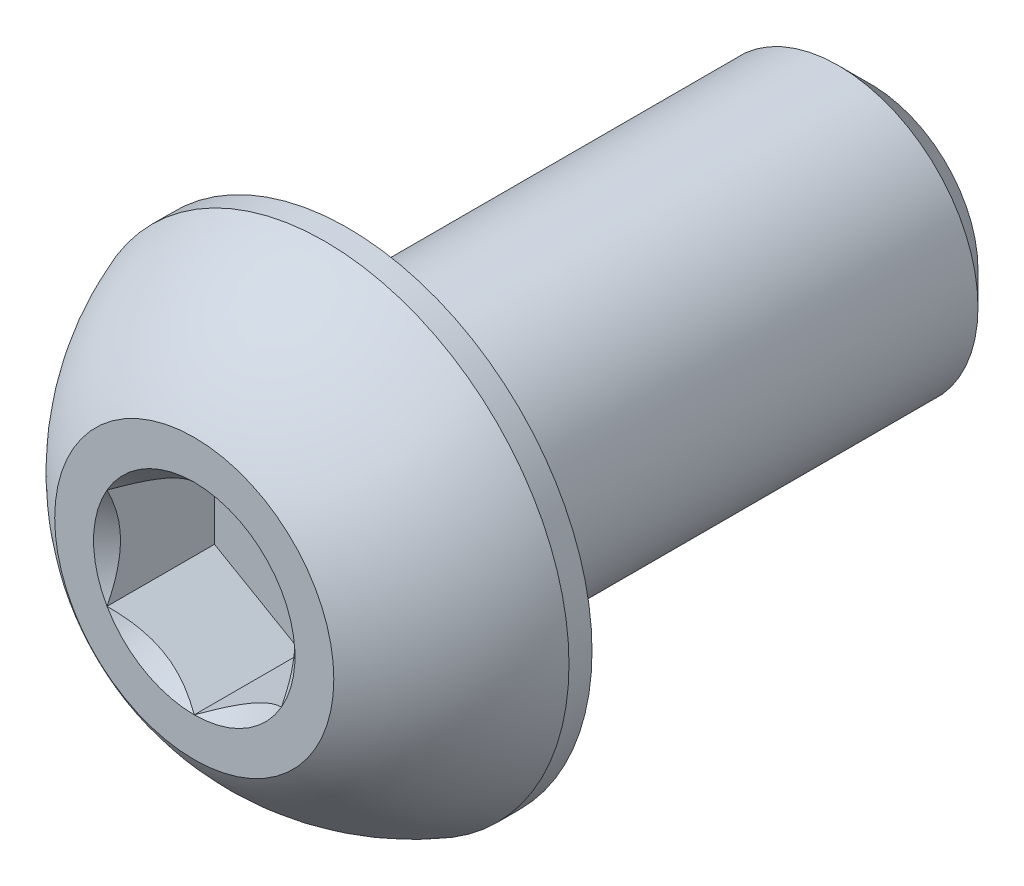
ISO-10303-21;
HEADER;
FILE_DESCRIPTION(('STEP AP214'),'2;1');
FILE_NAME('part.step','',(''),(''),'','','');
FILE_SCHEMA(('AUTOMOTIVE_DESIGN { 1 0 10303 214 1 1 1 1 }'));
ENDSEC;
DATA;
#1=APPLICATION_CONTEXT('core data for automotive mechanical design processes');
#2=APPLICATION_PROTOCOL_DEFINITION('international standard','automotive_design',2000,#1);
#3=PRODUCT_CONTEXT('',#1,'mechanical');
#4=PRODUCT('Part','Part','',(#3));
#5=PRODUCT_RELATED_PRODUCT_CATEGORY('part','',(#4));
#6=PRODUCT_DEFINITION_FORMATION('','',#4);
#7=PRODUCT_DEFINITION_CONTEXT('part definition',#1,'design');
#8=PRODUCT_DEFINITION('design','',#6,#7);
#9=PRODUCT_DEFINITION_SHAPE('','',#8);
#10=(LENGTH_UNIT() NAMED_UNIT(*) SI_UNIT(.MILLI.,.METRE.));
#11=(NAMED_UNIT(*) PLANE_ANGLE_UNIT() SI_UNIT($,.RADIAN.));
#12=(NAMED_UNIT(*) SI_UNIT($,.STERADIAN.) SOLID_ANGLE_UNIT());
#13=UNCERTAINTY_MEASURE_WITH_UNIT(LENGTH_MEASURE(1.E-05),#10,'distance_accuracy_value','');
#14=(GEOMETRIC_REPRESENTATION_CONTEXT(3) GLOBAL_UNCERTAINTY_ASSIGNED_CONTEXT((#13)) GLOBAL_UNIT_ASSIGNED_CONTEXT((#10,
#11,#12)) REPRESENTATION_CONTEXT('',''));
#15=CARTESIAN_POINT('',(0.,0.,0.));
#16=DIRECTION('',(0.,0.,1.));
#17=DIRECTION('',(1.,0.,0.));
#18=AXIS2_PLACEMENT_3D('',#15,#16,#17);
#19=CARTESIAN_POINT('',(0.,0.,-19.4));
#20=DIRECTION('',(0.,0.,1.));
#21=DIRECTION('',(1.,0.,0.));
#22=AXIS2_PLACEMENT_3D('',#19,#20,#21);
#23=PLANE('',#22);
#24=CARTESIAN_POINT('',(0.,0.,-19.4));
#25=DIRECTION('',(0.,0.,1.));
#26=DIRECTION('',(1.,0.,0.));
#27=AXIS2_PLACEMENT_3D('',#24,#25,#26);
#28=CIRCLE('',#27,3.06250000000002);
#29=CARTESIAN_POINT('',(3.06250000000002,0.,-19.4));
#30=VERTEX_POINT('',#29);
#31=EDGE_CURVE('E54',#30,#30,#28,.T.);
#32=ORIENTED_EDGE('',*,*,#31,.F.);
#33=EDGE_LOOP('',(#32));
#34=FACE_BOUND('',#33,.T.);
#35=ADVANCED_FACE('F41',(#34),#23,.F.);
#36=CARTESIAN_POINT('',(0.,0.,-19.4));
#37=DIRECTION('',(0.,0.,1.));
#38=DIRECTION('',(1.,0.,0.));
#39=AXIS2_PLACEMENT_3D('',#36,#37,#38);
#40=CONICAL_SURFACE('',#39,3.06250000000002,0.78539816339744);
#41=CARTESIAN_POINT('',(0.,0.,-18.4625));
#42=DIRECTION('',(0.,0.,1.));
#43=DIRECTION('',(1.,0.,0.));
#44=AXIS2_PLACEMENT_3D('',#41,#42,#43);
#45=CIRCLE('',#44,4.00000000000001);
#46=CARTESIAN_POINT('',(4.00000000000001,0.,-18.4625));
#47=VERTEX_POINT('',#46);
#48=EDGE_CURVE('E180',#47,#47,#45,.T.);
#49=ORIENTED_EDGE('',*,*,#48,.F.);
#50=EDGE_LOOP('',(#49));
#51=FACE_BOUND('',#50,.T.);
#52=ORIENTED_EDGE('',*,*,#31,.T.);
#53=EDGE_LOOP('',(#52));
#54=FACE_BOUND('',#53,.T.);
#55=ADVANCED_FACE('F185',(#51,#54),#40,.T.);
#56=CARTESIAN_POINT('',(0.,0.,0.));
#57=DIRECTION('',(0.,0.,1.));
#58=DIRECTION('',(1.,0.,0.));
#59=AXIS2_PLACEMENT_3D('',#56,#57,#58);
#60=CYLINDRICAL_SURFACE('',#59,4.00000000000001);
#61=CARTESIAN_POINT('',(0.,0.,-4.4));
#62=DIRECTION('',(0.,0.,1.));
#63=DIRECTION('',(1.,0.,0.));
#64=AXIS2_PLACEMENT_3D('',#61,#62,#63);
#65=CIRCLE('',#64,4.00000000000001);
#66=CARTESIAN_POINT('',(4.00000000000001,0.,-4.4));
#67=VERTEX_POINT('',#66);
#68=EDGE_CURVE('E177',#67,#67,#65,.T.);
#69=ORIENTED_EDGE('',*,*,#68,.F.);
#70=EDGE_LOOP('',(#69));
#71=FACE_BOUND('',#70,.T.);
#72=ORIENTED_EDGE('',*,*,#48,.T.);
#73=EDGE_LOOP('',(#72));
#74=FACE_BOUND('',#73,.T.);
#75=ADVANCED_FACE('F191',(#71,#74),#60,.T.);
#76=CARTESIAN_POINT('',(0.,-7.,-4.4));
#77=DIRECTION('',(0.,0.,1.));
#78=DIRECTION('',(1.,0.,0.));
#79=AXIS2_PLACEMENT_3D('',#76,#77,#78);
#80=PLANE('',#79);
#81=CARTESIAN_POINT('',(0.,0.,-4.4));
#82=DIRECTION('',(0.,0.,1.));
#83=DIRECTION('',(1.,0.,0.));
#84=AXIS2_PLACEMENT_3D('',#81,#82,#83);
#85=CIRCLE('',#84,7.);
#86=CARTESIAN_POINT('',(7.,0.,-4.4));
#87=VERTEX_POINT('',#86);
#88=EDGE_CURVE('E171',#87,#87,#85,.T.);
#89=ORIENTED_EDGE('',*,*,#88,.F.);
#90=EDGE_LOOP('',(#89));
#91=FACE_BOUND('',#90,.T.);
#92=ORIENTED_EDGE('',*,*,#68,.T.);
#93=EDGE_LOOP('',(#92));
#94=FACE_BOUND('',#93,.T.);
#95=ADVANCED_FACE('F196',(#91,#94),#80,.F.);
#96=CARTESIAN_POINT('',(0.,0.,-6.28176470588235));
#97=DIRECTION('',(0.,0.,1.));
#98=DIRECTION('',(0.,-1.,0.));
#99=AXIS2_PLACEMENT_3D('',#96,#97,#98);
#100=SPHERICAL_SURFACE('',#99,7.44718522799516);
#101=CARTESIAN_POINT('',(0.,0.,0.));
#102=DIRECTION('',(0.,0.,1.));
#103=DIRECTION('',(1.,0.,0.));
#104=AXIS2_PLACEMENT_3D('',#101,#102,#103);
#105=CIRCLE('',#104,4.00000000000001);
#106=CARTESIAN_POINT('',(0.,-4.00000000000001,0.));
#107=VERTEX_POINT('',#106);
#108=EDGE_CURVE('E174',#107,#107,#105,.T.);
#109=CARTESIAN_POINT('',(0.,0.,-3.74));
#110=DIRECTION('',(0.,0.,1.));
#111=DIRECTION('',(1.,0.,0.));
#112=AXIS2_PLACEMENT_3D('',#109,#110,#111);
#113=CIRCLE('',#112,7.);
#114=CARTESIAN_POINT('',(0.,-7.,-3.74));
#115=VERTEX_POINT('',#114);
#116=EDGE_CURVE('E168',#115,#115,#113,.T.);
#117=CARTESIAN_POINT('',(0.,-4.00000000000001,0.));
#118=CARTESIAN_POINT('',(0.,-4.0428912139663,-0.0273114768916097));
#119=CARTESIAN_POINT('',(0.,-4.08550262268995,-0.0550623662746863));
#120=CARTESIAN_POINT('',(0.,-4.17014814240247,-0.111431039851167));
#121=CARTESIAN_POINT('',(0.,-4.21218225339134,-0.140048824044572));
#122=CARTESIAN_POINT('',(0.,-4.29565549038475,-0.198139357069099));
#123=CARTESIAN_POINT('',(0.,-4.33709461638929,-0.227612105900221));
#124=CARTESIAN_POINT('',(0.,-4.41936051070081,-0.287400181855632));
#125=CARTESIAN_POINT('',(0.,-4.46018727900778,-0.31771550897992));
#126=CARTESIAN_POINT('',(0.,-4.54121132474489,-0.379176027774173));
#127=CARTESIAN_POINT('',(0.,-4.58140860217503,-0.410321219444137));
#128=CARTESIAN_POINT('',(0.,-4.66115680175155,-0.473428398402514));
#129=CARTESIAN_POINT('',(0.,-4.70070772389794,-0.505390385690926));
#130=CARTESIAN_POINT('',(0.,-4.77914661843988,-0.570117746134584));
#131=CARTESIAN_POINT('',(0.,-4.81803459083544,-0.602883119289829));
#132=CARTESIAN_POINT('',(0.,-4.89513126989405,-0.669203504140152));
#133=CARTESIAN_POINT('',(0.,-4.9333399765571,-0.70275851583523));
#134=CARTESIAN_POINT('',(0.,-5.00906209307587,-0.770644099267723));
#135=CARTESIAN_POINT('',(0.,-5.04657550293158,-0.804974671005139));
#136=CARTESIAN_POINT('',(0.,-5.12089128650743,-0.874396970590494));
#137=CARTESIAN_POINT('',(0.,-5.15769366022755,-0.909488698438432));
#138=CARTESIAN_POINT('',(0.,-5.23057193052378,-0.980418586967821));
#139=CARTESIAN_POINT('',(0.,-5.26664782709989,-1.01625674764927));
#140=CARTESIAN_POINT('',(0.,-5.33805800690611,-1.0886644653886));
#141=CARTESIAN_POINT('',(0.,-5.37339229013624,-1.12523402244648));
#142=CARTESIAN_POINT('',(0.,-5.44330441820348,-1.19908918961359));
#143=CARTESIAN_POINT('',(0.,-5.4778822630406,-1.23637479972282));
#144=CARTESIAN_POINT('',(0.,-5.5462670066504,-1.31164642923617));
#145=CARTESIAN_POINT('',(0.,-5.58007390542308,-1.34963244864029));
#146=CARTESIAN_POINT('',(0.,-5.64690257269493,-1.42628895911946));
#147=CARTESIAN_POINT('',(0.,-5.67992434119409,-1.4649594501945));
#148=CARTESIAN_POINT('',(0.,-5.74516889312342,-1.54296867921078));
#149=CARTESIAN_POINT('',(0.,-5.77739167655358,-1.58230741715202));
#150=CARTESIAN_POINT('',(0.,-5.84102473877602,-1.66163663472265));
#151=CARTESIAN_POINT('',(0.,-5.87243501756828,-1.70162711435204));
#152=CARTESIAN_POINT('',(0.,-5.93442989184496,-1.78224303667259));
#153=CARTESIAN_POINT('',(0.,-5.96501448732938,-1.82286847936374));
#154=CARTESIAN_POINT('',(0.,-6.02534516274862,-1.9047372827728));
#155=CARTESIAN_POINT('',(0.,-6.05509124268345,-1.9459806434907));
#156=CARTESIAN_POINT('',(0.,-6.11373240657404,-2.02906797866118));
#157=CARTESIAN_POINT('',(0.,-6.1426274905298,-2.07091195311374));
#158=CARTESIAN_POINT('',(0.,-6.19955453908126,-2.15518295946462));
#159=CARTESIAN_POINT('',(0.,-6.22758650367697,-2.19760999136295));
#160=CARTESIAN_POINT('',(0.,-6.28277555226269,-2.28302931168557));
#161=CARTESIAN_POINT('',(0.,-6.3099326362527,-2.32602160010988));
#162=CARTESIAN_POINT('',(0.,-6.36336052945034,-2.41255339540285));
#163=CARTESIAN_POINT('',(0.,-6.38963133865797,-2.45609290227151));
#164=CARTESIAN_POINT('',(0.,-6.44127565996739,-2.54370086677645));
#165=CARTESIAN_POINT('',(0.,-6.46664917206918,-2.58776932441273));
#166=CARTESIAN_POINT('',(0.,-6.5164882533076,-2.67641670085086));
#167=CARTESIAN_POINT('',(0.,-6.54095382244421,-2.7209956196527));
#168=CARTESIAN_POINT('',(0.,-6.5889667528749,-2.81064521463237));
#169=CARTESIAN_POINT('',(0.,-6.61251411416897,-2.8557158908102));
#170=CARTESIAN_POINT('',(0.,-6.65868074913471,-2.94633009048611));
#171=CARTESIAN_POINT('',(0.,-6.68130002280637,-2.99187361398419));
#172=CARTESIAN_POINT('',(0.,-6.72560099270397,-3.08341439963689));
#173=CARTESIAN_POINT('',(0.,-6.74728268892991,-3.12941166179151));
#174=CARTESIAN_POINT('',(0.,-6.78969940538681,-3.22184062653245));
#175=CARTESIAN_POINT('',(0.,-6.81043442561777,-3.26827232911879));
#176=CARTESIAN_POINT('',(0.,-6.85094909656955,-3.36155069119163));
#177=CARTESIAN_POINT('',(0.,-6.87072874729038,-3.40839735067814));
#178=CARTESIAN_POINT('',(0.,-6.90932435728194,-3.50248598022821));
#179=CARTESIAN_POINT('',(0.,-6.92814031655268,-3.54972795029177));
#180=CARTESIAN_POINT('',(0.,-6.96480073525398,-3.64458734660453));
#181=CARTESIAN_POINT('',(0.,-6.98264519468455,-3.69220477285372));
#182=CARTESIAN_POINT('',(0.,-7.,-3.74));
#183=B_SPLINE_CURVE_WITH_KNOTS('',3,(#117,#118,#119,#120,#121,#122,#123,#124,#125,#126,#127,
#128,#129,#130,#131,#132,#133,#134,#135,#136,#137,#138,#139,#140,#141,#142,#143,#144,#145,#146,
#147,#148,#149,#150,#151,#152,#153,#154,#155,#156,#157,#158,#159,#160,#161,#162,#163,#164,#165,
#166,#167,#168,#169,#170,#171,#172,#173,#174,#175,#176,#177,#178,#179,#180,#181,#182),
.UNSPECIFIED.,.F.,.F.,(4,2,2,2,2,2,2,2,2,2,2,2,2,2,2,2,2,2,2,2,2,2,2,2,2,2,2,2,2,2,2,2,4),(0.,
0.152542918530912,0.305085837061824,0.457628755592735,0.610171674123647,0.762714592654558,
0.91525751118547,1.06780042971638,1.22034334824729,1.3728862667782,1.52542918530912,
1.67797210384003,1.83051502237094,1.98305794090185,2.13560085943276,2.28814377796367,
2.44068669649459,2.5932296150255,2.74577253355641,2.89831545208732,3.05085837061823,
3.20340128914914,3.35594420768006,3.50848712621097,3.66103004474188,3.81357296327279,
3.9661158818037,4.11865880033461,4.27120171886553,4.42374463739644,4.57628755592735,
4.72883047445826,4.88137339298917),.UNSPECIFIED.);
#184=EDGE_CURVE('BSEAM201',#107,#115,#183,.T.);
#185=ORIENTED_EDGE('',*,*,#108,.F.);
#186=ORIENTED_EDGE('',*,*,#116,.T.);
#187=ORIENTED_EDGE('',*,*,#184,.T.);
#188=ORIENTED_EDGE('',*,*,#184,.F.);
#189=EDGE_LOOP('',(#185,#187,#186,#188));
#190=FACE_BOUND('',#189,.T.);
#191=ADVANCED_FACE('F201',(#190),#100,.T.);
#192=CARTESIAN_POINT('',(0.,-4.00000000000001,0.));
#193=DIRECTION('',(0.,0.,-1.));
#194=DIRECTION('',(-1.,0.,0.));
#195=AXIS2_PLACEMENT_3D('',#192,#193,#194);
#196=PLANE('',#195);
#197=CARTESIAN_POINT('',(0.,0.,0.));
#198=DIRECTION('',(0.,0.,1.));
#199=DIRECTION('',(1.,0.,0.));
#200=AXIS2_PLACEMENT_3D('',#197,#198,#199);
#201=CIRCLE('',#200,2.88675134594813);
#202=CARTESIAN_POINT('',(-2.5,1.44337567297406,0.));
#203=VERTEX_POINT('',#202);
#204=CARTESIAN_POINT('',(-2.5,-1.44337567297407,0.));
#205=VERTEX_POINT('',#204);
#206=EDGE_CURVE('E67',#203,#205,#201,.T.);
#207=ORIENTED_EDGE('',*,*,#206,.F.);
#208=CARTESIAN_POINT('',(0.,2.88675134594813,0.));
#209=VERTEX_POINT('',#208);
#210=EDGE_CURVE('E139',#209,#203,#201,.T.);
#211=ORIENTED_EDGE('',*,*,#210,.F.);
#212=CARTESIAN_POINT('',(2.5,1.44337567297406,0.));
#213=VERTEX_POINT('',#212);
#214=EDGE_CURVE('E136',#213,#209,#201,.T.);
#215=ORIENTED_EDGE('',*,*,#214,.F.);
#216=CARTESIAN_POINT('',(2.5,-1.44337567297406,0.));
#217=VERTEX_POINT('',#216);
#218=EDGE_CURVE('E107',#217,#213,#201,.T.);
#219=ORIENTED_EDGE('',*,*,#218,.F.);
#220=CARTESIAN_POINT('',(0.,-2.88675134594813,0.));
#221=VERTEX_POINT('',#220);
#222=EDGE_CURVE('E99',#221,#217,#201,.T.);
#223=ORIENTED_EDGE('',*,*,#222,.F.);
#224=EDGE_CURVE('E60',#205,#221,#201,.T.);
#225=ORIENTED_EDGE('',*,*,#224,.F.);
#226=EDGE_LOOP('',(#207,#211,#215,#219,#223,#225));
#227=FACE_BOUND('',#226,.T.);
#228=ORIENTED_EDGE('',*,*,#108,.T.);
#229=EDGE_LOOP('',(#228));
#230=FACE_BOUND('',#229,.T.);
#231=ADVANCED_FACE('F133',(#227,#230),#196,.F.);
#232=CARTESIAN_POINT('',(0.,0.,0.));
#233=DIRECTION('',(0.,0.,1.));
#234=DIRECTION('',(1.,0.,0.));
#235=AXIS2_PLACEMENT_3D('',#232,#233,#234);
#236=CYLINDRICAL_SURFACE('',#235,7.);
#237=ORIENTED_EDGE('',*,*,#116,.F.);
#238=EDGE_LOOP('',(#237));
#239=FACE_BOUND('',#238,.T.);
#240=ORIENTED_EDGE('',*,*,#88,.T.);
#241=EDGE_LOOP('',(#240));
#242=FACE_BOUND('',#241,.T.);
#243=ADVANCED_FACE('F207',(#239,#242),#236,.T.);
#244=CARTESIAN_POINT('',(0.,0.,0.));
#245=DIRECTION('',(0.,0.,1.));
#246=DIRECTION('',(1.,0.,0.));
#247=AXIS2_PLACEMENT_3D('',#244,#245,#246);
#248=CONICAL_SURFACE('',#247,2.88675134594813,0.78539816339745);
#249=ORIENTED_EDGE('',*,*,#218,.T.);
#250=CARTESIAN_POINT('',(2.5,-2.87868021616154,0.925964193784649));
#251=CARTESIAN_POINT('',(2.5,-2.80858751756354,0.87305476939949));
#252=CARTESIAN_POINT('',(2.5,-2.73810237384457,0.820656784806444));
#253=CARTESIAN_POINT('',(2.5,-2.59619238907469,0.717112683515217));
#254=CARTESIAN_POINT('',(2.5,-2.52476731657142,0.66596688437793));
#255=CARTESIAN_POINT('',(2.5,-2.38030019419698,0.564792497981433));
#256=CARTESIAN_POINT('',(2.5,-2.30724990359399,0.514775637784459));
#257=CARTESIAN_POINT('',(2.5,-2.15990937397294,0.416608843915505));
#258=CARTESIAN_POINT('',(2.5,-2.08561922308943,0.368458778345535));
#259=CARTESIAN_POINT('',(2.5,-1.93130274871408,0.27174655945196));
#260=CARTESIAN_POINT('',(2.5,-1.8511916849785,0.223318932537291));
#261=CARTESIAN_POINT('',(2.5,-1.68912282627167,0.129664059704143));
#262=CARTESIAN_POINT('',(2.5,-1.60716527674864,0.0844363916948273));
#263=CARTESIAN_POINT('',(2.5,-1.44137668632319,-0.00186462533073056));
#264=CARTESIAN_POINT('',(2.5,-1.35755175925796,-0.0429496273364135));
#265=CARTESIAN_POINT('',(2.5,-1.1876157775942,-0.120038133893405));
#266=CARTESIAN_POINT('',(2.5,-1.10150577924729,-0.156043939265441));
#267=CARTESIAN_POINT('',(2.5,-0.933895283730371,-0.219050255714908));
#268=CARTESIAN_POINT('',(2.5,-0.852581486652409,-0.246542279856903));
#269=CARTESIAN_POINT('',(2.5,-0.687996185051423,-0.295002885582602));
#270=CARTESIAN_POINT('',(2.5,-0.60472454608516,-0.315971017761042));
#271=CARTESIAN_POINT('',(2.5,-0.438105786501646,-0.349940004986967));
#272=CARTESIAN_POINT('',(2.5,-0.354786957377878,-0.363077366556388));
#273=CARTESIAN_POINT('',(2.5,-0.187258638268769,-0.381129805600401));
#274=CARTESIAN_POINT('',(2.5,-0.10304930389173,-0.386046296469836));
#275=CARTESIAN_POINT('',(2.5,0.0623819458555516,-0.387291925628101));
#276=CARTESIAN_POINT('',(2.5,0.143601667742497,-0.383925448289115));
#277=CARTESIAN_POINT('',(2.5,0.305344840533966,-0.369462407619083));
#278=CARTESIAN_POINT('',(2.5,0.38586822302966,-0.358365093346907));
#279=CARTESIAN_POINT('',(2.5,0.546999992477732,-0.32885792141466));
#280=CARTESIAN_POINT('',(2.5,0.627585258156381,-0.310323623169079));
#281=CARTESIAN_POINT('',(2.5,0.786991930978589,-0.26692766798593));
#282=CARTESIAN_POINT('',(2.5,0.865813485110826,-0.24206654048256));
#283=CARTESIAN_POINT('',(2.5,1.11399280220491,-0.154441088760135));
#284=CARTESIAN_POINT('',(2.5,1.27984027529456,-0.0816966645253821));
#285=CARTESIAN_POINT('',(2.5,1.52253018655039,0.0395423452678462));
#286=CARTESIAN_POINT('',(2.5,1.60256472908879,0.0820714512072061));
#287=CARTESIAN_POINT('',(2.5,1.76081489282125,0.170396524152195));
#288=CARTESIAN_POINT('',(2.5,1.83903083842887,0.216191902476715));
#289=CARTESIAN_POINT('',(2.5,1.99000684607168,0.308044678728651));
#290=CARTESIAN_POINT('',(2.5,2.06284472030444,0.353975635424461));
#291=CARTESIAN_POINT('',(2.5,2.20727164736135,0.447770245386509));
#292=CARTESIAN_POINT('',(2.5,2.27886060500402,0.495634045043623));
#293=CARTESIAN_POINT('',(2.5,2.42037078548403,0.592552236318337));
#294=CARTESIAN_POINT('',(2.5,2.49030083172878,0.641593798316213));
#295=CARTESIAN_POINT('',(2.5,2.62920524991558,0.740973835189783));
#296=CARTESIAN_POINT('',(2.5,2.6981798793784,0.791311949707411));
#297=CARTESIAN_POINT('',(2.5,2.76675463365823,0.84218029768243));
#298=B_SPLINE_CURVE_WITH_KNOTS('',3,(#250,#251,#252,#253,#254,#255,#256,#257,#258,#259,#260,
#261,#262,#263,#264,#265,#266,#267,#268,#269,#270,#271,#272,#273,#274,#275,#276,#277,#278,#279,
#280,#281,#282,#283,#284,#285,#286,#287,#288,#289,#290,#291,#292,#293,#294,#295,#296,#297),
.UNSPECIFIED.,.F.,.F.,(4,2,2,2,2,2,2,2,2,2,2,2,2,2,2,2,2,2,2,2,2,2,2,4),(0.,0.263465914971113,
0.526997968323235,0.792571943279358,1.05812711983771,1.33890112548018,1.61963802629078,
1.89956181222215,2.17935838571897,2.43663887682599,2.69393708705247,2.94660788173134,
3.19923523085015,3.44271854486785,3.68622551313359,3.93398926860572,4.18173229781967,
4.72334004841907,4.99521600382013,5.26704308216965,5.52534341671992,5.78366335141085,
6.03988492204046,6.2960360320754),.UNSPECIFIED.);
#299=EDGE_CURVE('E11',#217,#213,#298,.T.);
#300=ORIENTED_EDGE('',*,*,#299,.F.);
#301=EDGE_LOOP('',(#249,#300));
#302=FACE_BOUND('',#301,.T.);
#303=ADVANCED_FACE('F111',(#302),#248,.F.);
#304=ORIENTED_EDGE('',*,*,#214,.T.);
#305=CARTESIAN_POINT('',(2.5002,1.44326020292023,0.000115476981765064));
#306=CARTESIAN_POINT('',(2.41426172221224,1.49287669073468,-0.0494592946452721));
#307=CARTESIAN_POINT('',(2.32688643272425,1.5433228376411,-0.0961225186374935));
#308=CARTESIAN_POINT('',(2.14871854383441,1.64618811625259,-0.181561859961698));
#309=CARTESIAN_POINT('',(2.05790899931893,1.69861703122359,-0.220290437593997));
#310=CARTESIAN_POINT('',(1.87479587687308,1.80433744175986,-0.286633296102261));
#311=CARTESIAN_POINT('',(1.78253893547066,1.85760201171315,-0.314414331469143));
#312=CARTESIAN_POINT('',(1.59599399122371,1.96530378549009,-0.357216824089333));
#313=CARTESIAN_POINT('',(1.50171168743372,2.01973769896307,-0.372270233328655));
#314=CARTESIAN_POINT('',(1.33922174170815,2.11355131286833,-0.385852277790518));
#315=CARTESIAN_POINT('',(1.27122403211985,2.15280980880341,-0.387862900759198));
#316=CARTESIAN_POINT('',(1.13533975883078,2.23126263056549,-0.384475882812511));
#317=CARTESIAN_POINT('',(1.06745324244776,2.27045692907357,-0.379075644700178));
#318=CARTESIAN_POINT('',(0.932321211763893,2.34847544336505,-0.361174211597527));
#319=CARTESIAN_POINT('',(0.865076500246438,2.38729919566123,-0.348665072953518));
#320=CARTESIAN_POINT('',(0.7317498991818,2.46427534467603,-0.317232498044292));
#321=CARTESIAN_POINT('',(0.665667920900342,2.50242779262542,-0.29830955350318));
#322=CARTESIAN_POINT('',(0.496403653308734,2.60015256308362,-0.242132638591751));
#323=CARTESIAN_POINT('',(0.394270877777106,2.65911894852989,-0.200644168403811));
#324=CARTESIAN_POINT('',(0.244093585059491,2.74582384890657,-0.130605953276911));
#325=CARTESIAN_POINT('',(0.19460346011739,2.77439698586412,-0.105997747883925));
#326=CARTESIAN_POINT('',(0.096539936161153,2.83101398781794,-0.054538113284764));
#327=CARTESIAN_POINT('',(0.0479659965030719,2.85905816495513,-0.0276880612206437));
#328=CARTESIAN_POINT('',(-0.000200000000000122,2.88686681600197,0.000115476981764059));
#329=B_SPLINE_CURVE_WITH_KNOTS('',3,(#305,#306,#307,#308,#309,#310,#311,#312,#313,#314,#315,
#316,#317,#318,#319,#320,#321,#322,#323,#324,#325,#326,#327,#328),.UNSPECIFIED.,.F.,.F.,(4,2,2,
2,2,2,2,2,2,2,2,4),(0.,0.333012085133924,0.667964518301398,0.9975970320433,1.32639954393844,
1.56169424147169,1.79707142102083,2.03271213522171,2.26833478775651,2.64260240809533,
2.82922877818864,3.01574133749025),.UNSPECIFIED.);
#330=EDGE_CURVE('E138',#213,#209,#329,.T.);
#331=ORIENTED_EDGE('',*,*,#330,.F.);
#332=EDGE_LOOP('',(#304,#331));
#333=FACE_BOUND('',#332,.T.);
#334=ADVANCED_FACE('F294',(#333),#248,.F.);
#335=ORIENTED_EDGE('',*,*,#210,.T.);
#336=CARTESIAN_POINT('',(0.000199999999999641,2.88686681600197,0.000115476981764065));
#337=CARTESIAN_POINT('',(-0.0857382777877652,2.83725032818751,-0.0494592946452729));
#338=CARTESIAN_POINT('',(-0.173113567275754,2.7868041812811,-0.0961225186374941));
#339=CARTESIAN_POINT('',(-0.351281456165589,2.6839389026696,-0.181561859961699));
#340=CARTESIAN_POINT('',(-0.442091000681075,2.6315099876986,-0.220290437593998));
#341=CARTESIAN_POINT('',(-0.625204123126921,2.52578957716234,-0.286633296102261));
#342=CARTESIAN_POINT('',(-0.71746106452934,2.47252500720904,-0.314414331469143));
#343=CARTESIAN_POINT('',(-0.904006008776286,2.3648232334321,-0.357216824089333));
#344=CARTESIAN_POINT('',(-0.998288312566283,2.31038931995913,-0.372270233328655));
#345=CARTESIAN_POINT('',(-1.16077825829185,2.21657570605387,-0.385852277790517));
#346=CARTESIAN_POINT('',(-1.22877596788015,2.17731721011878,-0.387862900759197));
#347=CARTESIAN_POINT('',(-1.36466024116922,2.0988643883567,-0.38447588281251));
#348=CARTESIAN_POINT('',(-1.43254675755224,2.05967008984862,-0.379075644700178));
#349=CARTESIAN_POINT('',(-1.56767878823611,1.98165157555715,-0.361174211597527));
#350=CARTESIAN_POINT('',(-1.63492349975356,1.94282782326096,-0.348665072953518));
#351=CARTESIAN_POINT('',(-1.7682501008182,1.86585167424616,-0.317232498044292));
#352=CARTESIAN_POINT('',(-1.83433207909966,1.82769922629678,-0.29830955350318));
#353=CARTESIAN_POINT('',(-2.00359634669126,1.72997445583858,-0.242132638591752));
#354=CARTESIAN_POINT('',(-2.10572912222289,1.67100807039231,-0.200644168403812));
#355=CARTESIAN_POINT('',(-2.25590641494051,1.58430317001562,-0.130605953276912));
#356=CARTESIAN_POINT('',(-2.30539653988261,1.55573003305807,-0.105997747883926));
#357=CARTESIAN_POINT('',(-2.40346006383885,1.49911303110426,-0.0545381132847642));
#358=CARTESIAN_POINT('',(-2.45203400349693,1.47106885396706,-0.0276880612206439));
#359=CARTESIAN_POINT('',(-2.5002,1.44326020292023,0.000115476981763897));
#360=B_SPLINE_CURVE_WITH_KNOTS('',3,(#336,#337,#338,#339,#340,#341,#342,#343,#344,#345,#346,
#347,#348,#349,#350,#351,#352,#353,#354,#355,#356,#357,#358,#359),.UNSPECIFIED.,.F.,.F.,(4,2,2,
2,2,2,2,2,2,2,2,4),(0.,0.333012085133924,0.667964518301396,0.997597032043299,1.32639954393844,
1.56169424147169,1.79707142102083,2.03271213522171,2.2683347877565,2.64260240809533,
2.82922877818864,3.01574133749025),.UNSPECIFIED.);
#361=EDGE_CURVE('E143',#209,#203,#360,.T.);
#362=ORIENTED_EDGE('',*,*,#361,.F.);
#363=EDGE_LOOP('',(#335,#362));
#364=FACE_BOUND('',#363,.T.);
#365=ADVANCED_FACE('F146',(#364),#248,.F.);
#366=ORIENTED_EDGE('',*,*,#206,.T.);
#367=CARTESIAN_POINT('',(-2.5,-2.87868021616154,0.925964193784651));
#368=CARTESIAN_POINT('',(-2.5,-2.80858751756355,0.873054769399491));
#369=CARTESIAN_POINT('',(-2.5,-2.73810237384457,0.820656784806445));
#370=CARTESIAN_POINT('',(-2.5,-2.59619238907469,0.717112683515218));
#371=CARTESIAN_POINT('',(-2.5,-2.52476731657143,0.665966884377931));
#372=CARTESIAN_POINT('',(-2.5,-2.38030019419698,0.564792497981434));
#373=CARTESIAN_POINT('',(-2.5,-2.30724990359399,0.51477563778446));
#374=CARTESIAN_POINT('',(-2.5,-2.15990937397294,0.416608843915506));
#375=CARTESIAN_POINT('',(-2.5,-2.08561922308943,0.368458778345536));
#376=CARTESIAN_POINT('',(-2.5,-1.93130274871408,0.27174655945196));
#377=CARTESIAN_POINT('',(-2.5,-1.8511916849785,0.223318932537291));
#378=CARTESIAN_POINT('',(-2.5,-1.68912282627168,0.129664059704143));
#379=CARTESIAN_POINT('',(-2.5,-1.60716527674864,0.0844363916948273));
#380=CARTESIAN_POINT('',(-2.5,-1.44137668632319,-0.00186462533073067));
#381=CARTESIAN_POINT('',(-2.5,-1.35755175925796,-0.0429496273364138));
#382=CARTESIAN_POINT('',(-2.5,-1.1876157775942,-0.120038133893405));
#383=CARTESIAN_POINT('',(-2.5,-1.10150577924729,-0.156043939265442));
#384=CARTESIAN_POINT('',(-2.5,-0.933895283730374,-0.219050255714909));
#385=CARTESIAN_POINT('',(-2.5,-0.852581486652412,-0.246542279856903));
#386=CARTESIAN_POINT('',(-2.5,-0.687996185051426,-0.295002885582603));
#387=CARTESIAN_POINT('',(-2.5,-0.604724546085163,-0.315971017761043));
#388=CARTESIAN_POINT('',(-2.5,-0.438105786501649,-0.349940004986969));
#389=CARTESIAN_POINT('',(-2.5,-0.354786957377881,-0.363077366556389));
#390=CARTESIAN_POINT('',(-2.5,-0.187258638268772,-0.381129805600403));
#391=CARTESIAN_POINT('',(-2.5,-0.103049303891733,-0.386046296469838));
#392=CARTESIAN_POINT('',(-2.5,0.0623819458555495,-0.387291925628103));
#393=CARTESIAN_POINT('',(-2.5,0.143601667742494,-0.383925448289117));
#394=CARTESIAN_POINT('',(-2.5,0.305344840533964,-0.369462407619085));
#395=CARTESIAN_POINT('',(-2.5,0.385868223029658,-0.358365093346908));
#396=CARTESIAN_POINT('',(-2.5,0.54699999247773,-0.328857921414662));
#397=CARTESIAN_POINT('',(-2.5,0.627585258156379,-0.310323623169081));
#398=CARTESIAN_POINT('',(-2.5,0.786991930978586,-0.266927667985933));
#399=CARTESIAN_POINT('',(-2.5,0.865813485110824,-0.242066540482562));
#400=CARTESIAN_POINT('',(-2.5,1.11399280220491,-0.154441088760137));
#401=CARTESIAN_POINT('',(-2.5,1.27984027529456,-0.0816966645253844));
#402=CARTESIAN_POINT('',(-2.5,1.52253018655038,0.0395423452678432));
#403=CARTESIAN_POINT('',(-2.5,1.60256472908879,0.0820714512072026));
#404=CARTESIAN_POINT('',(-2.5,1.76081489282124,0.170396524152191));
#405=CARTESIAN_POINT('',(-2.5,1.83903083842886,0.216191902476711));
#406=CARTESIAN_POINT('',(-2.5,1.99000684607167,0.308044678728647));
#407=CARTESIAN_POINT('',(-2.5,2.06284472030444,0.353975635424457));
#408=CARTESIAN_POINT('',(-2.5,2.20727164736135,0.447770245386504));
#409=CARTESIAN_POINT('',(-2.5,2.27886060500402,0.495634045043618));
#410=CARTESIAN_POINT('',(-2.5,2.42037078548402,0.592552236318331));
#411=CARTESIAN_POINT('',(-2.5,2.49030083172878,0.641593798316207));
#412=CARTESIAN_POINT('',(-2.5,2.62920524991558,0.740973835189778));
#413=CARTESIAN_POINT('',(-2.5,2.69817987937839,0.791311949707406));
#414=CARTESIAN_POINT('',(-2.5,2.76675463365823,0.842180297682424));
#415=B_SPLINE_CURVE_WITH_KNOTS('',3,(#367,#368,#369,#370,#371,#372,#373,#374,#375,#376,#377,
#378,#379,#380,#381,#382,#383,#384,#385,#386,#387,#388,#389,#390,#391,#392,#393,#394,#395,#396,
#397,#398,#399,#400,#401,#402,#403,#404,#405,#406,#407,#408,#409,#410,#411,#412,#413,#414),
.UNSPECIFIED.,.F.,.F.,(4,2,2,2,2,2,2,2,2,2,2,2,2,2,2,2,2,2,2,2,2,2,2,4),(0.,0.263465914971114,
0.526997968323236,0.792571943279359,1.05812711983771,1.33890112548018,1.61963802629079,
1.89956181222216,2.17935838571897,2.43663887682599,2.69393708705247,2.94660788173134,
3.19923523085015,3.44271854486786,3.68622551313359,3.93398926860572,4.18173229781967,
4.72334004841907,4.99521600382013,5.26704308216965,5.52534341671992,5.78366335141085,
6.03988492204046,6.2960360320754),.UNSPECIFIED.);
#416=EDGE_CURVE('E150',#203,#205,#415,.F.);
#417=ORIENTED_EDGE('',*,*,#416,.F.);
#418=EDGE_LOOP('',(#366,#417));
#419=FACE_BOUND('',#418,.T.);
#420=ADVANCED_FACE('F288',(#419),#248,.F.);
#421=ORIENTED_EDGE('',*,*,#224,.T.);
#422=CARTESIAN_POINT('',(-2.5002,-1.44326020292023,0.000115476981763328));
#423=CARTESIAN_POINT('',(-2.41426172221223,-1.49287669073469,-0.0494592946452737));
#424=CARTESIAN_POINT('',(-2.32688643272425,-1.5433228376411,-0.0961225186374947));
#425=CARTESIAN_POINT('',(-2.14871854383441,-1.64618811625259,-0.181561859961699));
#426=CARTESIAN_POINT('',(-2.05790899931892,-1.69861703122359,-0.220290437593998));
#427=CARTESIAN_POINT('',(-1.87479587687308,-1.80433744175986,-0.286633296102261));
#428=CARTESIAN_POINT('',(-1.78253893547066,-1.85760201171315,-0.314414331469144));
#429=CARTESIAN_POINT('',(-1.59599399122371,-1.96530378549009,-0.357216824089334));
#430=CARTESIAN_POINT('',(-1.50171168743372,-2.01973769896306,-0.372270233328655));
#431=CARTESIAN_POINT('',(-1.33922174170815,-2.11355131286833,-0.385852277790518));
#432=CARTESIAN_POINT('',(-1.27122403211985,-2.15280980880341,-0.387862900759198));
#433=CARTESIAN_POINT('',(-1.13533975883078,-2.23126263056549,-0.384475882812511));
#434=CARTESIAN_POINT('',(-1.06745324244776,-2.27045692907357,-0.379075644700178));
#435=CARTESIAN_POINT('',(-0.932321211763894,-2.34847544336505,-0.361174211597527));
#436=CARTESIAN_POINT('',(-0.865076500246439,-2.38729919566123,-0.348665072953518));
#437=CARTESIAN_POINT('',(-0.731749899181801,-2.46427534467603,-0.317232498044292));
#438=CARTESIAN_POINT('',(-0.665667920900342,-2.50242779262542,-0.29830955350318));
#439=CARTESIAN_POINT('',(-0.496403653308735,-2.60015256308362,-0.242132638591751));
#440=CARTESIAN_POINT('',(-0.394270877777107,-2.65911894852989,-0.200644168403811));
#441=CARTESIAN_POINT('',(-0.244093585059491,-2.74582384890657,-0.130605953276911));
#442=CARTESIAN_POINT('',(-0.19460346011739,-2.77439698586412,-0.105997747883925));
#443=CARTESIAN_POINT('',(-0.0965399361611528,-2.83101398781794,-0.0545381132847637));
#444=CARTESIAN_POINT('',(-0.0479659965030717,-2.85905816495513,-0.0276880612206435));
#445=CARTESIAN_POINT('',(0.000200000000000093,-2.88686681600197,0.00011547698176449));
#446=B_SPLINE_CURVE_WITH_KNOTS('',3,(#422,#423,#424,#425,#426,#427,#428,#429,#430,#431,#432,
#433,#434,#435,#436,#437,#438,#439,#440,#441,#442,#443,#444,#445),.UNSPECIFIED.,.F.,.F.,(4,2,2,
2,2,2,2,2,2,2,2,4),(0.,0.333012085133923,0.667964518301396,0.997597032043298,1.32639954393844,
1.56169424147168,1.79707142102083,2.03271213522171,2.2683347877565,2.64260240809533,
2.82922877818864,3.01574133749025),.UNSPECIFIED.);
#447=EDGE_CURVE('E123',#205,#221,#446,.T.);
#448=ORIENTED_EDGE('',*,*,#447,.F.);
#449=EDGE_LOOP('',(#421,#448));
#450=FACE_BOUND('',#449,.T.);
#451=ADVANCED_FACE('F236',(#450),#248,.F.);
#452=ORIENTED_EDGE('',*,*,#222,.T.);
#453=CARTESIAN_POINT('',(-0.000199999999999967,-2.88686681600197,0.000115476981764065));
#454=CARTESIAN_POINT('',(0.0857382777877649,-2.83725032818751,-0.0494592946452728));
#455=CARTESIAN_POINT('',(0.173113567275753,-2.7868041812811,-0.0961225186374943));
#456=CARTESIAN_POINT('',(0.351281456165589,-2.6839389026696,-0.181561859961699));
#457=CARTESIAN_POINT('',(0.442091000681075,-2.6315099876986,-0.220290437593998));
#458=CARTESIAN_POINT('',(0.625204123126921,-2.52578957716234,-0.286633296102261));
#459=CARTESIAN_POINT('',(0.717461064529341,-2.47252500720904,-0.314414331469144));
#460=CARTESIAN_POINT('',(0.904006008776286,-2.3648232334321,-0.357216824089334));
#461=CARTESIAN_POINT('',(0.998288312566283,-2.31038931995913,-0.372270233328656));
#462=CARTESIAN_POINT('',(1.16077825829185,-2.21657570605387,-0.385852277790518));
#463=CARTESIAN_POINT('',(1.22877596788015,-2.17731721011878,-0.387862900759198));
#464=CARTESIAN_POINT('',(1.36466024116922,-2.0988643883567,-0.384475882812511));
#465=CARTESIAN_POINT('',(1.43254675755224,-2.05967008984862,-0.379075644700179));
#466=CARTESIAN_POINT('',(1.56767878823611,-1.98165157555714,-0.361174211597528));
#467=CARTESIAN_POINT('',(1.63492349975356,-1.94282782326096,-0.348665072953518));
#468=CARTESIAN_POINT('',(1.7682501008182,-1.86585167424616,-0.317232498044292));
#469=CARTESIAN_POINT('',(1.83433207909966,-1.82769922629677,-0.298309553503181));
#470=CARTESIAN_POINT('',(2.00359634669126,-1.72997445583857,-0.242132638591752));
#471=CARTESIAN_POINT('',(2.10572912222289,-1.67100807039231,-0.200644168403812));
#472=CARTESIAN_POINT('',(2.25590641494051,-1.58430317001562,-0.130605953276912));
#473=CARTESIAN_POINT('',(2.30539653988261,-1.55573003305807,-0.105997747883926));
#474=CARTESIAN_POINT('',(2.40346006383885,-1.49911303110425,-0.0545381132847641));
#475=CARTESIAN_POINT('',(2.45203400349693,-1.47106885396706,-0.0276880612206438));
#476=CARTESIAN_POINT('',(2.5002,-1.44326020292022,0.000115476981764058));
#477=B_SPLINE_CURVE_WITH_KNOTS('',3,(#453,#454,#455,#456,#457,#458,#459,#460,#461,#462,#463,
#464,#465,#466,#467,#468,#469,#470,#471,#472,#473,#474,#475,#476),.UNSPECIFIED.,.F.,.F.,(4,2,2,
2,2,2,2,2,2,2,2,4),(0.,0.333012085133924,0.667964518301397,0.997597032043299,1.32639954393844,
1.56169424147169,1.79707142102083,2.03271213522171,2.26833478775651,2.64260240809533,
2.82922877818864,3.01574133749025),.UNSPECIFIED.);
#478=EDGE_CURVE('E103',#221,#217,#477,.T.);
#479=ORIENTED_EDGE('',*,*,#478,.F.);
#480=EDGE_LOOP('',(#452,#479));
#481=FACE_BOUND('',#480,.T.);
#482=ADVANCED_FACE('F101',(#481),#248,.F.);
#483=CARTESIAN_POINT('',(2.5,-1.44337567297406,-3.08));
#484=DIRECTION('',(0.,0.,1.));
#485=DIRECTION('',(1.,0.,0.));
#486=AXIS2_PLACEMENT_3D('',#483,#484,#485);
#487=PLANE('',#486);
#488=DIRECTION('',(0.866025403784438,0.5,0.));
#489=VECTOR('',#488,1.);
#490=CARTESIAN_POINT('',(0.,-2.88675134594813,-3.08));
#491=LINE('',#490,#489);
#492=CARTESIAN_POINT('',(0.,-2.88675134594813,-3.08));
#493=VERTEX_POINT('',#492);
#494=CARTESIAN_POINT('',(2.5,-1.44337567297406,-3.08));
#495=VERTEX_POINT('',#494);
#496=EDGE_CURVE('E122',#493,#495,#491,.T.);
#497=ORIENTED_EDGE('',*,*,#496,.T.);
#498=DIRECTION('',(0.,1.,0.));
#499=VECTOR('',#498,1.);
#500=CARTESIAN_POINT('',(2.5,-1.44337567297406,-3.08));
#501=LINE('',#500,#499);
#502=CARTESIAN_POINT('',(2.5,1.44337567297406,-3.08));
#503=VERTEX_POINT('',#502);
#504=EDGE_CURVE('E127',#495,#503,#501,.T.);
#505=ORIENTED_EDGE('',*,*,#504,.T.);
#506=DIRECTION('',(-0.866025403784439,0.5,0.));
#507=VECTOR('',#506,1.);
#508=CARTESIAN_POINT('',(2.5,1.44337567297406,-3.08));
#509=LINE('',#508,#507);
#510=CARTESIAN_POINT('',(0.,2.88675134594813,-3.08));
#511=VERTEX_POINT('',#510);
#512=EDGE_CURVE('E278',#503,#511,#509,.T.);
#513=ORIENTED_EDGE('',*,*,#512,.T.);
#514=DIRECTION('',(-0.866025403784439,-0.5,0.));
#515=VECTOR('',#514,1.);
#516=CARTESIAN_POINT('',(0.,2.88675134594813,-3.08));
#517=LINE('',#516,#515);
#518=CARTESIAN_POINT('',(-2.5,1.44337567297406,-3.08));
#519=VERTEX_POINT('',#518);
#520=EDGE_CURVE('E159',#511,#519,#517,.T.);
#521=ORIENTED_EDGE('',*,*,#520,.T.);
#522=DIRECTION('',(0.,-1.,0.));
#523=VECTOR('',#522,1.);
#524=CARTESIAN_POINT('',(-2.5,1.44337567297406,-3.08));
#525=LINE('',#524,#523);
#526=CARTESIAN_POINT('',(-2.5,-1.44337567297406,-3.08));
#527=VERTEX_POINT('',#526);
#528=EDGE_CURVE('E282',#519,#527,#525,.T.);
#529=ORIENTED_EDGE('',*,*,#528,.T.);
#530=DIRECTION('',(0.866025403784439,-0.5,0.));
#531=VECTOR('',#530,1.);
#532=CARTESIAN_POINT('',(-2.5,-1.44337567297406,-3.08));
#533=LINE('',#532,#531);
#534=EDGE_CURVE('E130',#527,#493,#533,.T.);
#535=ORIENTED_EDGE('',*,*,#534,.T.);
#536=EDGE_LOOP('',(#497,#505,#513,#521,#529,#535));
#537=FACE_BOUND('',#536,.T.);
#538=ADVANCED_FACE('F235',(#537),#487,.T.);
#539=CARTESIAN_POINT('',(2.5,-1.44337567297406,-3.08));
#540=DIRECTION('',(1.,0.,0.));
#541=DIRECTION('',(0.,1.,0.));
#542=AXIS2_PLACEMENT_3D('',#539,#540,#541);
#543=PLANE('',#542);
#544=DIRECTION('',(0.,0.,1.));
#545=VECTOR('',#544,1.);
#546=CARTESIAN_POINT('',(2.5,-1.44337567297406,-3.08));
#547=LINE('',#546,#545);
#548=EDGE_CURVE('E119',#495,#217,#547,.T.);
#549=ORIENTED_EDGE('',*,*,#548,.T.);
#550=ORIENTED_EDGE('',*,*,#299,.T.);
#551=DIRECTION('',(0.,0.,1.));
#552=VECTOR('',#551,1.);
#553=CARTESIAN_POINT('',(2.5,1.44337567297406,-3.08));
#554=LINE('',#553,#552);
#555=EDGE_CURVE('E129',#503,#213,#554,.T.);
#556=ORIENTED_EDGE('',*,*,#555,.F.);
#557=ORIENTED_EDGE('',*,*,#504,.F.);
#558=EDGE_LOOP('',(#549,#550,#556,#557));
#559=FACE_BOUND('',#558,.T.);
#560=ADVANCED_FACE('F125',(#559),#543,.F.);
#561=CARTESIAN_POINT('',(2.5,1.44337567297406,-3.08));
#562=DIRECTION('',(0.5,0.866025403784439,0.));
#563=DIRECTION('',(-0.866025403784439,0.5,0.));
#564=AXIS2_PLACEMENT_3D('',#561,#562,#563);
#565=PLANE('',#564);
#566=ORIENTED_EDGE('',*,*,#555,.T.);
#567=ORIENTED_EDGE('',*,*,#330,.T.);
#568=DIRECTION('',(0.,0.,1.));
#569=VECTOR('',#568,1.);
#570=CARTESIAN_POINT('',(0.,2.88675134594813,-3.08));
#571=LINE('',#570,#569);
#572=EDGE_CURVE('E155',#511,#209,#571,.T.);
#573=ORIENTED_EDGE('',*,*,#572,.F.);
#574=ORIENTED_EDGE('',*,*,#512,.F.);
#575=EDGE_LOOP('',(#566,#567,#573,#574));
#576=FACE_BOUND('',#575,.T.);
#577=ADVANCED_FACE('F153',(#576),#565,.F.);
#578=CARTESIAN_POINT('',(0.,2.88675134594813,-3.08));
#579=DIRECTION('',(-0.5,0.866025403784439,0.));
#580=DIRECTION('',(-0.866025403784439,-0.5,0.));
#581=AXIS2_PLACEMENT_3D('',#578,#579,#580);
#582=PLANE('',#581);
#583=ORIENTED_EDGE('',*,*,#572,.T.);
#584=ORIENTED_EDGE('',*,*,#361,.T.);
#585=DIRECTION('',(0.,0.,1.));
#586=VECTOR('',#585,1.);
#587=CARTESIAN_POINT('',(-2.5,1.44337567297406,-3.08));
#588=LINE('',#587,#586);
#589=EDGE_CURVE('E161',#519,#203,#588,.T.);
#590=ORIENTED_EDGE('',*,*,#589,.F.);
#591=ORIENTED_EDGE('',*,*,#520,.F.);
#592=EDGE_LOOP('',(#583,#584,#590,#591));
#593=FACE_BOUND('',#592,.T.);
#594=ADVANCED_FACE('F157',(#593),#582,.F.);
#595=CARTESIAN_POINT('',(-2.5,1.44337567297406,-3.08));
#596=DIRECTION('',(-1.,0.,0.));
#597=DIRECTION('',(0.,-1.,0.));
#598=AXIS2_PLACEMENT_3D('',#595,#596,#597);
#599=PLANE('',#598);
#600=ORIENTED_EDGE('',*,*,#589,.T.);
#601=ORIENTED_EDGE('',*,*,#416,.T.);
#602=DIRECTION('',(0.,0.,1.));
#603=VECTOR('',#602,1.);
#604=CARTESIAN_POINT('',(-2.5,-1.44337567297406,-3.08));
#605=LINE('',#604,#603);
#606=EDGE_CURVE('E163',#527,#205,#605,.T.);
#607=ORIENTED_EDGE('',*,*,#606,.F.);
#608=ORIENTED_EDGE('',*,*,#528,.F.);
#609=EDGE_LOOP('',(#600,#601,#607,#608));
#610=FACE_BOUND('',#609,.T.);
#611=ADVANCED_FACE('F257',(#610),#599,.F.);
#612=CARTESIAN_POINT('',(-2.5,-1.44337567297406,-3.08));
#613=DIRECTION('',(-0.5,-0.866025403784439,0.));
#614=DIRECTION('',(0.866025403784439,-0.5,0.));
#615=AXIS2_PLACEMENT_3D('',#612,#613,#614);
#616=PLANE('',#615);
#617=ORIENTED_EDGE('',*,*,#606,.T.);
#618=ORIENTED_EDGE('',*,*,#447,.T.);
#619=DIRECTION('',(0.,0.,1.));
#620=VECTOR('',#619,1.);
#621=CARTESIAN_POINT('',(0.,-2.88675134594813,-3.08));
#622=LINE('',#621,#620);
#623=EDGE_CURVE('E121',#493,#221,#622,.T.);
#624=ORIENTED_EDGE('',*,*,#623,.F.);
#625=ORIENTED_EDGE('',*,*,#534,.F.);
#626=EDGE_LOOP('',(#617,#618,#624,#625));
#627=FACE_BOUND('',#626,.T.);
#628=ADVANCED_FACE('F216',(#627),#616,.F.);
#629=CARTESIAN_POINT('',(0.,-2.88675134594813,-3.08));
#630=DIRECTION('',(0.5,-0.866025403784438,0.));
#631=DIRECTION('',(0.866025403784439,0.5,0.));
#632=AXIS2_PLACEMENT_3D('',#629,#630,#631);
#633=PLANE('',#632);
#634=ORIENTED_EDGE('',*,*,#623,.T.);
#635=ORIENTED_EDGE('',*,*,#478,.T.);
#636=ORIENTED_EDGE('',*,*,#548,.F.);
#637=ORIENTED_EDGE('',*,*,#496,.F.);
#638=EDGE_LOOP('',(#634,#635,#636,#637));
#639=FACE_BOUND('',#638,.T.);
#640=ADVANCED_FACE('F117',(#639),#633,.F.);
#641=CLOSED_SHELL('',(#35,#55,#75,#95,#191,#231,#243,#303,#334,#365,#420,#451,#482,#538,#560,
#577,#594,#611,#628,#640));
#642=MANIFOLD_SOLID_BREP('B2',#641);
#643=ADVANCED_BREP_SHAPE_REPRESENTATION('',(#18,#642),#14);
#644=SHAPE_DEFINITION_REPRESENTATION(#9,#643);
ENDSEC;
END-ISO-10303-21;
